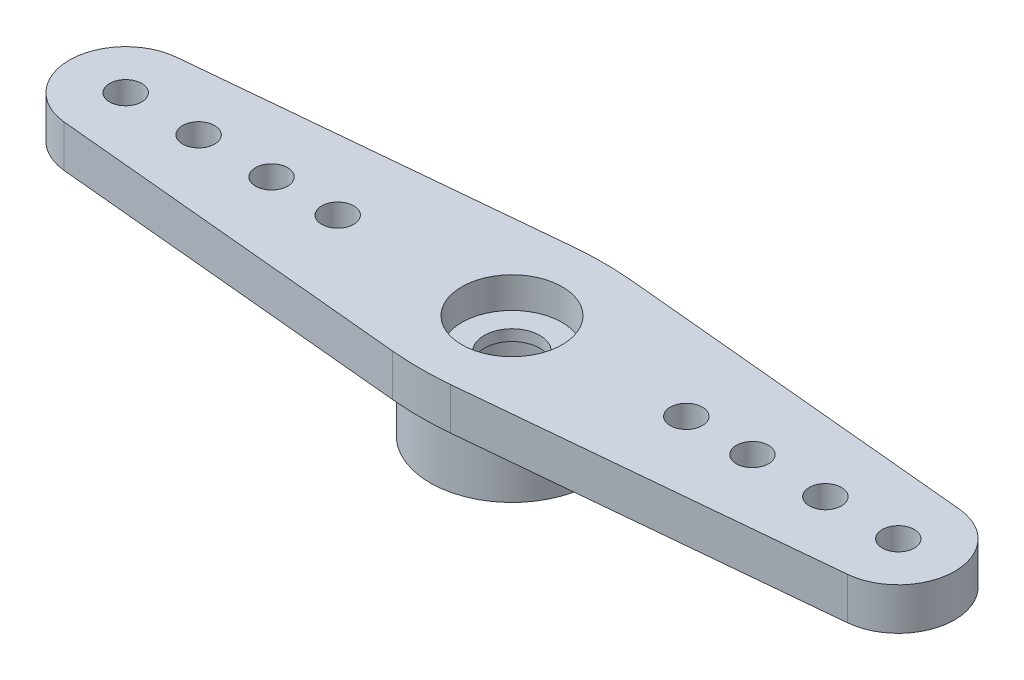
ISO-10303-21;
HEADER;
FILE_DESCRIPTION(('STEP AP214'),'2;1');
FILE_NAME('part.step','',(''),(''),'','','');
FILE_SCHEMA(('AUTOMOTIVE_DESIGN { 1 0 10303 214 1 1 1 1 }'));
ENDSEC;
DATA;
#1=APPLICATION_CONTEXT('core data for automotive mechanical design processes');
#2=APPLICATION_PROTOCOL_DEFINITION('international standard','automotive_design',2000,#1);
#3=PRODUCT_CONTEXT('',#1,'mechanical');
#4=PRODUCT('Part','Part','',(#3));
#5=PRODUCT_RELATED_PRODUCT_CATEGORY('part','',(#4));
#6=PRODUCT_DEFINITION_FORMATION('','',#4);
#7=PRODUCT_DEFINITION_CONTEXT('part definition',#1,'design');
#8=PRODUCT_DEFINITION('design','',#6,#7);
#9=PRODUCT_DEFINITION_SHAPE('','',#8);
#10=(LENGTH_UNIT() NAMED_UNIT(*) SI_UNIT(.MILLI.,.METRE.));
#11=(NAMED_UNIT(*) PLANE_ANGLE_UNIT() SI_UNIT($,.RADIAN.));
#12=(NAMED_UNIT(*) SI_UNIT($,.STERADIAN.) SOLID_ANGLE_UNIT());
#13=UNCERTAINTY_MEASURE_WITH_UNIT(LENGTH_MEASURE(1.E-05),#10,'distance_accuracy_value','');
#14=(GEOMETRIC_REPRESENTATION_CONTEXT(3) GLOBAL_UNCERTAINTY_ASSIGNED_CONTEXT((#13)) GLOBAL_UNIT_ASSIGNED_CONTEXT((#10,
#11,#12)) REPRESENTATION_CONTEXT('',''));
#15=CARTESIAN_POINT('',(0.,0.,0.));
#16=DIRECTION('',(0.,0.,1.));
#17=DIRECTION('',(1.,0.,0.));
#18=AXIS2_PLACEMENT_3D('',#15,#16,#17);
#19=CARTESIAN_POINT('',(0.,4.82616851665375,0.));
#20=DIRECTION('',(0.,-1.,0.));
#21=DIRECTION('',(0.,0.,-1.));
#22=AXIS2_PLACEMENT_3D('',#19,#20,#21);
#23=CYLINDRICAL_SURFACE('',#22,1.69612530915087);
#24=CARTESIAN_POINT('',(0.,2.26313471615911,0.));
#25=DIRECTION('',(0.,1.,0.));
#26=DIRECTION('',(0.,0.,1.));
#27=AXIS2_PLACEMENT_3D('',#24,#25,#26);
#28=CIRCLE('',#27,1.69612530915087);
#29=CARTESIAN_POINT('',(0.,2.26313471615911,1.69612530915087));
#30=VERTEX_POINT('',#29);
#31=EDGE_CURVE('E200',#30,#30,#28,.T.);
#32=ORIENTED_EDGE('',*,*,#31,.F.);
#33=EDGE_LOOP('',(#32));
#34=FACE_BOUND('',#33,.T.);
#35=CARTESIAN_POINT('',(0.,2.94158483981945,0.));
#36=DIRECTION('',(0.,1.,0.));
#37=DIRECTION('',(0.,0.,1.));
#38=AXIS2_PLACEMENT_3D('',#35,#36,#37);
#39=CIRCLE('',#38,1.69612530915087);
#40=CARTESIAN_POINT('',(0.,2.94158483981945,1.69612530915087));
#41=VERTEX_POINT('',#40);
#42=EDGE_CURVE('E360',#41,#41,#39,.F.);
#43=ORIENTED_EDGE('',*,*,#42,.F.);
#44=EDGE_LOOP('',(#43));
#45=FACE_BOUND('',#44,.T.);
#46=ADVANCED_FACE('F38',(#34,#45),#23,.F.);
#47=CARTESIAN_POINT('',(0.,-1.50603263750948,0.));
#48=DIRECTION('',(0.,1.,0.));
#49=DIRECTION('',(0.,0.,1.));
#50=AXIS2_PLACEMENT_3D('',#47,#48,#49);
#51=PLANE('',#50);
#52=CARTESIAN_POINT('',(0.,-1.50603263750948,0.));
#53=DIRECTION('',(0.,1.,0.));
#54=DIRECTION('',(0.,0.,1.));
#55=AXIS2_PLACEMENT_3D('',#52,#53,#54);
#56=CIRCLE('',#55,4.99414674361088);
#57=CARTESIAN_POINT('',(0.,-1.50603263750948,4.99414674361088));
#58=VERTEX_POINT('',#57);
#59=EDGE_CURVE('E214',#58,#58,#56,.T.);
#60=ORIENTED_EDGE('',*,*,#59,.F.);
#61=EDGE_LOOP('',(#60));
#62=FACE_BOUND('',#61,.T.);
#63=CARTESIAN_POINT('',(0.,-1.50603263750948,0.));
#64=DIRECTION('',(0.,1.,0.));
#65=DIRECTION('',(0.,0.,1.));
#66=AXIS2_PLACEMENT_3D('',#63,#64,#65);
#67=CIRCLE('',#66,3.31686727122836);
#68=CARTESIAN_POINT('',(0.,-1.50603263750948,3.31686727122836));
#69=VERTEX_POINT('',#68);
#70=EDGE_CURVE('E211',#69,#69,#67,.T.);
#71=ORIENTED_EDGE('',*,*,#70,.T.);
#72=EDGE_LOOP('',(#71));
#73=FACE_BOUND('',#72,.T.);
#74=ADVANCED_FACE('F261',(#62,#73),#51,.F.);
#75=CARTESIAN_POINT('',(0.,2.26313471615911,0.));
#76=DIRECTION('',(0.,-1.,0.));
#77=DIRECTION('',(0.,0.,-1.));
#78=AXIS2_PLACEMENT_3D('',#75,#76,#77);
#79=CYLINDRICAL_SURFACE('',#78,4.99414674361088);
#80=CARTESIAN_POINT('',(0.,2.26313471615911,0.));
#81=DIRECTION('',(0.,1.,0.));
#82=DIRECTION('',(0.,0.,1.));
#83=AXIS2_PLACEMENT_3D('',#80,#81,#82);
#84=CIRCLE('',#83,4.99414674361088);
#85=CARTESIAN_POINT('',(0.,2.26313471615911,4.99414674361088));
#86=VERTEX_POINT('',#85);
#87=EDGE_CURVE('E215',#86,#86,#84,.T.);
#88=ORIENTED_EDGE('',*,*,#87,.F.);
#89=EDGE_LOOP('',(#88));
#90=FACE_BOUND('',#89,.T.);
#91=ORIENTED_EDGE('',*,*,#59,.T.);
#92=EDGE_LOOP('',(#91));
#93=FACE_BOUND('',#92,.T.);
#94=ADVANCED_FACE('F267',(#90,#93),#79,.T.);
#95=CARTESIAN_POINT('',(0.,2.26313471615911,0.));
#96=DIRECTION('',(0.,-1.,0.));
#97=DIRECTION('',(0.,0.,-1.));
#98=AXIS2_PLACEMENT_3D('',#95,#96,#97);
#99=CYLINDRICAL_SURFACE('',#98,3.31686727122836);
#100=CARTESIAN_POINT('',(0.,2.26313471615911,0.));
#101=DIRECTION('',(0.,1.,0.));
#102=DIRECTION('',(0.,0.,1.));
#103=AXIS2_PLACEMENT_3D('',#100,#101,#102);
#104=CIRCLE('',#103,3.31686727122836);
#105=CARTESIAN_POINT('',(0.,2.26313471615911,3.31686727122836));
#106=VERTEX_POINT('',#105);
#107=EDGE_CURVE('E123',#106,#106,#104,.T.);
#108=ORIENTED_EDGE('',*,*,#107,.T.);
#109=EDGE_LOOP('',(#108));
#110=FACE_BOUND('',#109,.T.);
#111=ORIENTED_EDGE('',*,*,#70,.F.);
#112=EDGE_LOOP('',(#111));
#113=FACE_BOUND('',#112,.T.);
#114=ADVANCED_FACE('F320',(#110,#113),#99,.F.);
#115=CARTESIAN_POINT('',(-43.123904383595,2.26313471615911,0.));
#116=DIRECTION('',(0.,1.,0.));
#117=DIRECTION('',(0.,0.,1.));
#118=AXIS2_PLACEMENT_3D('',#115,#116,#117);
#119=PLANE('',#118);
#120=CARTESIAN_POINT('',(-14.6620610057708,2.26313471615911,0.));
#121=DIRECTION('',(0.,1.,0.));
#122=DIRECTION('',(0.,0.,1.));
#123=AXIS2_PLACEMENT_3D('',#120,#121,#122);
#124=CIRCLE('',#123,0.979983511953833);
#125=CARTESIAN_POINT('',(-14.6620610057708,2.26313471615911,0.979983511953833));
#126=VERTEX_POINT('',#125);
#127=EDGE_CURVE('E163',#126,#126,#124,.F.);
#128=ORIENTED_EDGE('',*,*,#127,.F.);
#129=EDGE_LOOP('',(#128));
#130=FACE_BOUND('',#129,.T.);
#131=DIRECTION('',(-0.995596740434201,0.,0.0937396950965555));
#132=VECTOR('',#131,1.);
#133=CARTESIAN_POINT('',(-43.2743750893069,2.26313471615911,-1.59812920218379));
#134=LINE('',#133,#132);
#135=CARTESIAN_POINT('',(-1.76660299250389,2.26313471615911,-5.5062636329923));
#136=VERTEX_POINT('',#135);
#137=CARTESIAN_POINT('',(-23.8797010065607,2.26313471615911,-3.4242207924604));
#138=VERTEX_POINT('',#137);
#139=EDGE_CURVE('E119',#136,#138,#134,.T.);
#140=ORIENTED_EDGE('',*,*,#139,.F.);
#141=CARTESIAN_POINT('',(0.,2.26313471615911,13.2565900243249));
#142=DIRECTION('',(0.,1.,0.));
#143=DIRECTION('',(0.,0.,1.));
#144=AXIS2_PLACEMENT_3D('',#141,#142,#143);
#145=CIRCLE('',#144,18.8458367683429);
#146=CARTESIAN_POINT('',(1.76660299250396,2.26313471615911,-5.5062636329923));
#147=VERTEX_POINT('',#146);
#148=EDGE_CURVE('E224',#136,#147,#145,.F.);
#149=ORIENTED_EDGE('',*,*,#148,.T.);
#150=DIRECTION('',(0.995596740434201,0.,0.0937396950965555));
#151=VECTOR('',#150,1.);
#152=CARTESIAN_POINT('',(-42.215562932358,2.26313471615911,-9.64737283518253));
#153=LINE('',#152,#151);
#154=CARTESIAN_POINT('',(23.8797010065607,2.26313471615911,-3.4242207924604));
#155=VERTEX_POINT('',#154);
#156=EDGE_CURVE('E177',#147,#155,#153,.T.);
#157=ORIENTED_EDGE('',*,*,#156,.T.);
#158=CARTESIAN_POINT('',(23.5572959604287,2.26313471615911,0.));
#159=DIRECTION('',(0.,1.,0.));
#160=DIRECTION('',(0.,0.,1.));
#161=AXIS2_PLACEMENT_3D('',#158,#159,#160);
#162=CIRCLE('',#161,3.43936521022259);
#163=CARTESIAN_POINT('',(23.8797010065607,2.26313471615911,3.4242207924604));
#164=VERTEX_POINT('',#163);
#165=EDGE_CURVE('E174',#164,#155,#162,.T.);
#166=ORIENTED_EDGE('',*,*,#165,.F.);
#167=DIRECTION('',(0.995596740434201,0.,-0.0937396950965555));
#168=VECTOR('',#167,1.);
#169=CARTESIAN_POINT('',(-42.215562932358,2.26313471615911,9.64737283518253));
#170=LINE('',#169,#168);
#171=CARTESIAN_POINT('',(1.76660299250394,2.26313471615911,5.5062636329923));
#172=VERTEX_POINT('',#171);
#173=EDGE_CURVE('E172',#172,#164,#170,.T.);
#174=ORIENTED_EDGE('',*,*,#173,.F.);
#175=CARTESIAN_POINT('',(0.,2.26313471615911,-13.256590024325));
#176=DIRECTION('',(0.,1.,0.));
#177=DIRECTION('',(0.,0.,1.));
#178=AXIS2_PLACEMENT_3D('',#175,#176,#177);
#179=CIRCLE('',#178,18.8458367683429);
#180=CARTESIAN_POINT('',(-1.7666029925039,2.26313471615911,5.5062636329923));
#181=VERTEX_POINT('',#180);
#182=EDGE_CURVE('E222',#172,#181,#179,.F.);
#183=ORIENTED_EDGE('',*,*,#182,.T.);
#184=DIRECTION('',(-0.995596740434201,0.,-0.0937396950965555));
#185=VECTOR('',#184,1.);
#186=CARTESIAN_POINT('',(-43.2743750893069,2.26313471615911,1.59812920218379));
#187=LINE('',#186,#185);
#188=CARTESIAN_POINT('',(-23.8797010065607,2.26313471615911,3.4242207924604));
#189=VERTEX_POINT('',#188);
#190=EDGE_CURVE('E170',#181,#189,#187,.T.);
#191=ORIENTED_EDGE('',*,*,#190,.T.);
#192=CARTESIAN_POINT('',(-23.5572959604287,2.26313471615911,0.));
#193=DIRECTION('',(0.,1.,0.));
#194=DIRECTION('',(0.,0.,1.));
#195=AXIS2_PLACEMENT_3D('',#192,#193,#194);
#196=CIRCLE('',#195,3.43936521022259);
#197=EDGE_CURVE('E168',#189,#138,#196,.F.);
#198=ORIENTED_EDGE('',*,*,#197,.T.);
#199=EDGE_LOOP('',(#140,#149,#157,#166,#174,#183,#191,#198));
#200=FACE_BOUND('',#199,.T.);
#201=CARTESIAN_POINT('',(-10.6290519373454,2.26313471615911,0.));
#202=DIRECTION('',(0.,1.,0.));
#203=DIRECTION('',(0.,0.,1.));
#204=AXIS2_PLACEMENT_3D('',#201,#202,#203);
#205=CIRCLE('',#204,0.979983511953833);
#206=CARTESIAN_POINT('',(-10.6290519373454,2.26313471615911,0.979983511953833));
#207=VERTEX_POINT('',#206);
#208=EDGE_CURVE('E179',#207,#207,#205,.F.);
#209=ORIENTED_EDGE('',*,*,#208,.F.);
#210=EDGE_LOOP('',(#209));
#211=FACE_BOUND('',#210,.T.);
#212=CARTESIAN_POINT('',(-19.1096784830998,2.26313471615911,0.));
#213=DIRECTION('',(0.,1.,0.));
#214=DIRECTION('',(0.,0.,1.));
#215=AXIS2_PLACEMENT_3D('',#212,#213,#214);
#216=CIRCLE('',#215,0.979983511953831);
#217=CARTESIAN_POINT('',(-19.1096784830998,2.26313471615911,0.979983511953831));
#218=VERTEX_POINT('',#217);
#219=EDGE_CURVE('E182',#218,#218,#216,.F.);
#220=ORIENTED_EDGE('',*,*,#219,.F.);
#221=EDGE_LOOP('',(#220));
#222=FACE_BOUND('',#221,.T.);
#223=CARTESIAN_POINT('',(-23.5572959604287,2.26313471615911,0.));
#224=DIRECTION('',(0.,1.,0.));
#225=DIRECTION('',(0.,0.,1.));
#226=AXIS2_PLACEMENT_3D('',#223,#224,#225);
#227=CIRCLE('',#226,0.979983511953831);
#228=CARTESIAN_POINT('',(-23.5572959604287,2.26313471615911,0.979983511953831));
#229=VERTEX_POINT('',#228);
#230=EDGE_CURVE('E185',#229,#229,#227,.F.);
#231=ORIENTED_EDGE('',*,*,#230,.F.);
#232=EDGE_LOOP('',(#231));
#233=FACE_BOUND('',#232,.T.);
#234=CARTESIAN_POINT('',(19.1096784830998,2.26313471615911,0.));
#235=DIRECTION('',(0.,1.,0.));
#236=DIRECTION('',(0.,0.,1.));
#237=AXIS2_PLACEMENT_3D('',#234,#235,#236);
#238=CIRCLE('',#237,0.979983511953831);
#239=CARTESIAN_POINT('',(19.1096784830998,2.26313471615911,0.979983511953831));
#240=VERTEX_POINT('',#239);
#241=EDGE_CURVE('E188',#240,#240,#238,.T.);
#242=ORIENTED_EDGE('',*,*,#241,.T.);
#243=EDGE_LOOP('',(#242));
#244=FACE_BOUND('',#243,.T.);
#245=CARTESIAN_POINT('',(14.6620610057708,2.26313471615911,0.));
#246=DIRECTION('',(0.,1.,0.));
#247=DIRECTION('',(0.,0.,1.));
#248=AXIS2_PLACEMENT_3D('',#245,#246,#247);
#249=CIRCLE('',#248,0.979983511953833);
#250=CARTESIAN_POINT('',(14.6620610057708,2.26313471615911,0.979983511953833));
#251=VERTEX_POINT('',#250);
#252=EDGE_CURVE('E191',#251,#251,#249,.T.);
#253=ORIENTED_EDGE('',*,*,#252,.T.);
#254=EDGE_LOOP('',(#253));
#255=FACE_BOUND('',#254,.T.);
#256=CARTESIAN_POINT('',(10.6290519373454,2.26313471615911,0.));
#257=DIRECTION('',(0.,1.,0.));
#258=DIRECTION('',(0.,0.,1.));
#259=AXIS2_PLACEMENT_3D('',#256,#257,#258);
#260=CIRCLE('',#259,0.979983511953833);
#261=CARTESIAN_POINT('',(10.6290519373454,2.26313471615911,0.979983511953833));
#262=VERTEX_POINT('',#261);
#263=EDGE_CURVE('E194',#262,#262,#260,.T.);
#264=ORIENTED_EDGE('',*,*,#263,.T.);
#265=EDGE_LOOP('',(#264));
#266=FACE_BOUND('',#265,.T.);
#267=CARTESIAN_POINT('',(23.5572959604287,2.26313471615911,0.));
#268=DIRECTION('',(0.,1.,0.));
#269=DIRECTION('',(0.,0.,1.));
#270=AXIS2_PLACEMENT_3D('',#267,#268,#269);
#271=CIRCLE('',#270,0.979983511953831);
#272=CARTESIAN_POINT('',(23.5572959604287,2.26313471615911,0.979983511953831));
#273=VERTEX_POINT('',#272);
#274=EDGE_CURVE('E197',#273,#273,#271,.T.);
#275=ORIENTED_EDGE('',*,*,#274,.T.);
#276=EDGE_LOOP('',(#275));
#277=FACE_BOUND('',#276,.T.);
#278=ORIENTED_EDGE('',*,*,#87,.T.);
#279=EDGE_LOOP('',(#278));
#280=FACE_BOUND('',#279,.T.);
#281=ADVANCED_FACE('F238',(#130,#200,#211,#222,#233,#244,#255,#266,#277,#280),#119,.F.);
#282=CARTESIAN_POINT('',(-43.2743750893069,4.82616851665375,-1.59812920218379));
#283=DIRECTION('',(0.0937396950965555,0.,0.995596740434201));
#284=DIRECTION('',(0.995596740434201,0.,-0.0937396950965555));
#285=AXIS2_PLACEMENT_3D('',#282,#283,#284);
#286=PLANE('',#285);
#287=DIRECTION('',(-0.995596740434201,0.,0.0937396950965555));
#288=VECTOR('',#287,1.);
#289=CARTESIAN_POINT('',(-43.2743750893069,4.82616851665375,-1.59812920218379));
#290=LINE('',#289,#288);
#291=CARTESIAN_POINT('',(-1.76660299250389,4.82616851665375,-5.5062636329923));
#292=VERTEX_POINT('',#291);
#293=CARTESIAN_POINT('',(-23.8797010065607,4.82616851665375,-3.4242207924604));
#294=VERTEX_POINT('',#293);
#295=EDGE_CURVE('E101',#292,#294,#290,.T.);
#296=ORIENTED_EDGE('',*,*,#295,.F.);
#297=DIRECTION('',(0.,-1.,0.));
#298=VECTOR('',#297,1.);
#299=CARTESIAN_POINT('',(-1.7666029925039,2.26313471615911,-5.5062636329923));
#300=LINE('',#299,#298);
#301=EDGE_CURVE('E218',#292,#136,#300,.T.);
#302=ORIENTED_EDGE('',*,*,#301,.T.);
#303=ORIENTED_EDGE('',*,*,#139,.T.);
#304=DIRECTION('',(0.,-1.,0.));
#305=VECTOR('',#304,1.);
#306=CARTESIAN_POINT('',(-23.8797010065607,4.82616851665375,-3.4242207924604));
#307=LINE('',#306,#305);
#308=EDGE_CURVE('E116',#294,#138,#307,.T.);
#309=ORIENTED_EDGE('',*,*,#308,.F.);
#310=EDGE_LOOP('',(#296,#302,#303,#309));
#311=FACE_BOUND('',#310,.T.);
#312=ADVANCED_FACE('F117',(#311),#286,.F.);
#313=CARTESIAN_POINT('',(-23.5572959604287,4.82616851665375,0.));
#314=DIRECTION('',(0.,-1.,0.));
#315=DIRECTION('',(0.,0.,-1.));
#316=AXIS2_PLACEMENT_3D('',#313,#314,#315);
#317=CYLINDRICAL_SURFACE('',#316,3.43936521022259);
#318=ORIENTED_EDGE('',*,*,#197,.F.);
#319=DIRECTION('',(0.,-1.,0.));
#320=VECTOR('',#319,1.);
#321=CARTESIAN_POINT('',(-23.8797010065607,4.82616851665375,3.4242207924604));
#322=LINE('',#321,#320);
#323=CARTESIAN_POINT('',(-23.8797010065607,4.82616851665375,3.4242207924604));
#324=VERTEX_POINT('',#323);
#325=EDGE_CURVE('E124',#324,#189,#322,.T.);
#326=ORIENTED_EDGE('',*,*,#325,.F.);
#327=CARTESIAN_POINT('',(-23.5572959604287,4.82616851665375,0.));
#328=DIRECTION('',(0.,1.,0.));
#329=DIRECTION('',(0.,0.,1.));
#330=AXIS2_PLACEMENT_3D('',#327,#328,#329);
#331=CIRCLE('',#330,3.43936521022259);
#332=EDGE_CURVE('E107',#324,#294,#331,.F.);
#333=ORIENTED_EDGE('',*,*,#332,.T.);
#334=ORIENTED_EDGE('',*,*,#308,.T.);
#335=EDGE_LOOP('',(#318,#326,#333,#334));
#336=FACE_BOUND('',#335,.T.);
#337=ADVANCED_FACE('F127',(#336),#317,.T.);
#338=CARTESIAN_POINT('',(-43.2743750893069,4.82616851665375,1.59812920218379));
#339=DIRECTION('',(-0.0937396950965555,0.,0.995596740434201));
#340=DIRECTION('',(0.995596740434201,0.,0.0937396950965555));
#341=AXIS2_PLACEMENT_3D('',#338,#339,#340);
#342=PLANE('',#341);
#343=ORIENTED_EDGE('',*,*,#190,.F.);
#344=DIRECTION('',(0.,-1.,0.));
#345=VECTOR('',#344,1.);
#346=CARTESIAN_POINT('',(-1.76660299250392,4.82616851665375,5.5062636329923));
#347=LINE('',#346,#345);
#348=CARTESIAN_POINT('',(-1.7666029925039,4.82616851665375,5.5062636329923));
#349=VERTEX_POINT('',#348);
#350=EDGE_CURVE('E11',#181,#349,#347,.F.);
#351=ORIENTED_EDGE('',*,*,#350,.T.);
#352=DIRECTION('',(-0.995596740434201,0.,-0.0937396950965555));
#353=VECTOR('',#352,1.);
#354=CARTESIAN_POINT('',(-43.2743750893069,4.82616851665375,1.59812920218379));
#355=LINE('',#354,#353);
#356=EDGE_CURVE('E129',#349,#324,#355,.T.);
#357=ORIENTED_EDGE('',*,*,#356,.T.);
#358=ORIENTED_EDGE('',*,*,#325,.T.);
#359=EDGE_LOOP('',(#343,#351,#357,#358));
#360=FACE_BOUND('',#359,.T.);
#361=ADVANCED_FACE('F249',(#360),#342,.T.);
#362=CARTESIAN_POINT('',(-42.215562932358,4.82616851665375,9.64737283518253));
#363=DIRECTION('',(-0.0937396950965555,0.,-0.995596740434201));
#364=DIRECTION('',(-0.995596740434201,0.,0.0937396950965555));
#365=AXIS2_PLACEMENT_3D('',#362,#363,#364);
#366=PLANE('',#365);
#367=DIRECTION('',(0.995596740434201,0.,-0.0937396950965555));
#368=VECTOR('',#367,1.);
#369=CARTESIAN_POINT('',(-42.215562932358,4.82616851665375,9.64737283518253));
#370=LINE('',#369,#368);
#371=CARTESIAN_POINT('',(1.76660299250394,4.82616851665375,5.5062636329923));
#372=VERTEX_POINT('',#371);
#373=CARTESIAN_POINT('',(23.8797010065607,4.82616851665375,3.4242207924604));
#374=VERTEX_POINT('',#373);
#375=EDGE_CURVE('E131',#372,#374,#370,.T.);
#376=ORIENTED_EDGE('',*,*,#375,.F.);
#377=DIRECTION('',(0.,-1.,0.));
#378=VECTOR('',#377,1.);
#379=CARTESIAN_POINT('',(1.76660299250393,2.26313471615911,5.5062636329923));
#380=LINE('',#379,#378);
#381=EDGE_CURVE('E46',#372,#172,#380,.T.);
#382=ORIENTED_EDGE('',*,*,#381,.T.);
#383=ORIENTED_EDGE('',*,*,#173,.T.);
#384=DIRECTION('',(0.,-1.,0.));
#385=VECTOR('',#384,1.);
#386=CARTESIAN_POINT('',(23.8797010065607,4.82616851665375,3.4242207924604));
#387=LINE('',#386,#385);
#388=EDGE_CURVE('E205',#374,#164,#387,.T.);
#389=ORIENTED_EDGE('',*,*,#388,.F.);
#390=EDGE_LOOP('',(#376,#382,#383,#389));
#391=FACE_BOUND('',#390,.T.);
#392=ADVANCED_FACE('F233',(#391),#366,.F.);
#393=CARTESIAN_POINT('',(23.5572959604287,4.82616851665375,0.));
#394=DIRECTION('',(0.,-1.,0.));
#395=DIRECTION('',(0.,0.,-1.));
#396=AXIS2_PLACEMENT_3D('',#393,#394,#395);
#397=CYLINDRICAL_SURFACE('',#396,3.43936521022259);
#398=ORIENTED_EDGE('',*,*,#165,.T.);
#399=DIRECTION('',(0.,-1.,0.));
#400=VECTOR('',#399,1.);
#401=CARTESIAN_POINT('',(23.8797010065607,4.82616851665375,-3.4242207924604));
#402=LINE('',#401,#400);
#403=CARTESIAN_POINT('',(23.8797010065607,4.82616851665375,-3.4242207924604));
#404=VERTEX_POINT('',#403);
#405=EDGE_CURVE('E162',#404,#155,#402,.T.);
#406=ORIENTED_EDGE('',*,*,#405,.F.);
#407=CARTESIAN_POINT('',(23.5572959604287,4.82616851665375,0.));
#408=DIRECTION('',(0.,1.,0.));
#409=DIRECTION('',(0.,0.,1.));
#410=AXIS2_PLACEMENT_3D('',#407,#408,#409);
#411=CIRCLE('',#410,3.43936521022259);
#412=EDGE_CURVE('E136',#374,#404,#411,.T.);
#413=ORIENTED_EDGE('',*,*,#412,.F.);
#414=ORIENTED_EDGE('',*,*,#388,.T.);
#415=EDGE_LOOP('',(#398,#406,#413,#414));
#416=FACE_BOUND('',#415,.T.);
#417=ADVANCED_FACE('F243',(#416),#397,.T.);
#418=CARTESIAN_POINT('',(23.5572959604287,4.82616851665375,0.));
#419=DIRECTION('',(0.,-1.,0.));
#420=DIRECTION('',(0.,0.,-1.));
#421=AXIS2_PLACEMENT_3D('',#418,#419,#420);
#422=CYLINDRICAL_SURFACE('',#421,0.979983511953831);
#423=CARTESIAN_POINT('',(23.5572959604287,4.82616851665375,0.));
#424=DIRECTION('',(0.,1.,0.));
#425=DIRECTION('',(0.,0.,1.));
#426=AXIS2_PLACEMENT_3D('',#423,#424,#425);
#427=CIRCLE('',#426,0.979983511953831);
#428=CARTESIAN_POINT('',(23.5572959604287,4.82616851665375,0.979983511953831));
#429=VERTEX_POINT('',#428);
#430=EDGE_CURVE('E159',#429,#429,#427,.T.);
#431=ORIENTED_EDGE('',*,*,#430,.T.);
#432=EDGE_LOOP('',(#431));
#433=FACE_BOUND('',#432,.T.);
#434=ORIENTED_EDGE('',*,*,#274,.F.);
#435=EDGE_LOOP('',(#434));
#436=FACE_BOUND('',#435,.T.);
#437=ADVANCED_FACE('F275',(#433,#436),#422,.F.);
#438=CARTESIAN_POINT('',(10.6290519373454,4.82616851665375,0.));
#439=DIRECTION('',(0.,-1.,0.));
#440=DIRECTION('',(0.,0.,-1.));
#441=AXIS2_PLACEMENT_3D('',#438,#439,#440);
#442=CYLINDRICAL_SURFACE('',#441,0.979983511953833);
#443=CARTESIAN_POINT('',(10.6290519373454,4.82616851665375,0.));
#444=DIRECTION('',(0.,1.,0.));
#445=DIRECTION('',(0.,0.,1.));
#446=AXIS2_PLACEMENT_3D('',#443,#444,#445);
#447=CIRCLE('',#446,0.979983511953833);
#448=CARTESIAN_POINT('',(10.6290519373454,4.82616851665375,0.979983511953833));
#449=VERTEX_POINT('',#448);
#450=EDGE_CURVE('E156',#449,#449,#447,.T.);
#451=ORIENTED_EDGE('',*,*,#450,.T.);
#452=EDGE_LOOP('',(#451));
#453=FACE_BOUND('',#452,.T.);
#454=ORIENTED_EDGE('',*,*,#263,.F.);
#455=EDGE_LOOP('',(#454));
#456=FACE_BOUND('',#455,.T.);
#457=ADVANCED_FACE('F278',(#453,#456),#442,.F.);
#458=CARTESIAN_POINT('',(14.6620610057708,4.82616851665375,0.));
#459=DIRECTION('',(0.,-1.,0.));
#460=DIRECTION('',(0.,0.,-1.));
#461=AXIS2_PLACEMENT_3D('',#458,#459,#460);
#462=CYLINDRICAL_SURFACE('',#461,0.979983511953833);
#463=CARTESIAN_POINT('',(14.6620610057708,4.82616851665375,0.));
#464=DIRECTION('',(0.,1.,0.));
#465=DIRECTION('',(0.,0.,1.));
#466=AXIS2_PLACEMENT_3D('',#463,#464,#465);
#467=CIRCLE('',#466,0.979983511953833);
#468=CARTESIAN_POINT('',(14.6620610057708,4.82616851665375,0.979983511953833));
#469=VERTEX_POINT('',#468);
#470=EDGE_CURVE('E153',#469,#469,#467,.T.);
#471=ORIENTED_EDGE('',*,*,#470,.T.);
#472=EDGE_LOOP('',(#471));
#473=FACE_BOUND('',#472,.T.);
#474=ORIENTED_EDGE('',*,*,#252,.F.);
#475=EDGE_LOOP('',(#474));
#476=FACE_BOUND('',#475,.T.);
#477=ADVANCED_FACE('F282',(#473,#476),#462,.F.);
#478=CARTESIAN_POINT('',(19.1096784830998,4.82616851665375,0.));
#479=DIRECTION('',(0.,-1.,0.));
#480=DIRECTION('',(0.,0.,-1.));
#481=AXIS2_PLACEMENT_3D('',#478,#479,#480);
#482=CYLINDRICAL_SURFACE('',#481,0.979983511953831);
#483=CARTESIAN_POINT('',(19.1096784830998,4.82616851665375,0.));
#484=DIRECTION('',(0.,1.,0.));
#485=DIRECTION('',(0.,0.,1.));
#486=AXIS2_PLACEMENT_3D('',#483,#484,#485);
#487=CIRCLE('',#486,0.979983511953831);
#488=CARTESIAN_POINT('',(19.1096784830998,4.82616851665375,0.979983511953831));
#489=VERTEX_POINT('',#488);
#490=EDGE_CURVE('E150',#489,#489,#487,.T.);
#491=ORIENTED_EDGE('',*,*,#490,.T.);
#492=EDGE_LOOP('',(#491));
#493=FACE_BOUND('',#492,.T.);
#494=ORIENTED_EDGE('',*,*,#241,.F.);
#495=EDGE_LOOP('',(#494));
#496=FACE_BOUND('',#495,.T.);
#497=ADVANCED_FACE('F286',(#493,#496),#482,.F.);
#498=CARTESIAN_POINT('',(-23.5572959604287,4.82616851665375,0.));
#499=DIRECTION('',(0.,-1.,0.));
#500=DIRECTION('',(0.,0.,-1.));
#501=AXIS2_PLACEMENT_3D('',#498,#499,#500);
#502=CYLINDRICAL_SURFACE('',#501,0.979983511953831);
#503=CARTESIAN_POINT('',(-23.5572959604287,4.82616851665375,0.));
#504=DIRECTION('',(0.,1.,0.));
#505=DIRECTION('',(0.,0.,1.));
#506=AXIS2_PLACEMENT_3D('',#503,#504,#505);
#507=CIRCLE('',#506,0.979983511953831);
#508=CARTESIAN_POINT('',(-23.5572959604287,4.82616851665375,0.979983511953831));
#509=VERTEX_POINT('',#508);
#510=EDGE_CURVE('E147',#509,#509,#507,.F.);
#511=ORIENTED_EDGE('',*,*,#510,.F.);
#512=EDGE_LOOP('',(#511));
#513=FACE_BOUND('',#512,.T.);
#514=ORIENTED_EDGE('',*,*,#230,.T.);
#515=EDGE_LOOP('',(#514));
#516=FACE_BOUND('',#515,.T.);
#517=ADVANCED_FACE('F290',(#513,#516),#502,.F.);
#518=CARTESIAN_POINT('',(-19.1096784830998,4.82616851665375,0.));
#519=DIRECTION('',(0.,-1.,0.));
#520=DIRECTION('',(0.,0.,-1.));
#521=AXIS2_PLACEMENT_3D('',#518,#519,#520);
#522=CYLINDRICAL_SURFACE('',#521,0.979983511953831);
#523=CARTESIAN_POINT('',(-19.1096784830998,4.82616851665375,0.));
#524=DIRECTION('',(0.,1.,0.));
#525=DIRECTION('',(0.,0.,1.));
#526=AXIS2_PLACEMENT_3D('',#523,#524,#525);
#527=CIRCLE('',#526,0.979983511953831);
#528=CARTESIAN_POINT('',(-19.1096784830998,4.82616851665375,0.979983511953831));
#529=VERTEX_POINT('',#528);
#530=EDGE_CURVE('E144',#529,#529,#527,.F.);
#531=ORIENTED_EDGE('',*,*,#530,.F.);
#532=EDGE_LOOP('',(#531));
#533=FACE_BOUND('',#532,.T.);
#534=ORIENTED_EDGE('',*,*,#219,.T.);
#535=EDGE_LOOP('',(#534));
#536=FACE_BOUND('',#535,.T.);
#537=ADVANCED_FACE('F294',(#533,#536),#522,.F.);
#538=CARTESIAN_POINT('',(-10.6290519373454,4.82616851665375,0.));
#539=DIRECTION('',(0.,-1.,0.));
#540=DIRECTION('',(0.,0.,-1.));
#541=AXIS2_PLACEMENT_3D('',#538,#539,#540);
#542=CYLINDRICAL_SURFACE('',#541,0.979983511953833);
#543=CARTESIAN_POINT('',(-10.6290519373454,4.82616851665375,0.));
#544=DIRECTION('',(0.,1.,0.));
#545=DIRECTION('',(0.,0.,1.));
#546=AXIS2_PLACEMENT_3D('',#543,#544,#545);
#547=CIRCLE('',#546,0.979983511953833);
#548=CARTESIAN_POINT('',(-10.6290519373454,4.82616851665375,0.979983511953833));
#549=VERTEX_POINT('',#548);
#550=EDGE_CURVE('E141',#549,#549,#547,.F.);
#551=ORIENTED_EDGE('',*,*,#550,.F.);
#552=EDGE_LOOP('',(#551));
#553=FACE_BOUND('',#552,.T.);
#554=ORIENTED_EDGE('',*,*,#208,.T.);
#555=EDGE_LOOP('',(#554));
#556=FACE_BOUND('',#555,.T.);
#557=ADVANCED_FACE('F298',(#553,#556),#542,.F.);
#558=CARTESIAN_POINT('',(-42.215562932358,4.82616851665375,-9.64737283518253));
#559=DIRECTION('',(0.0937396950965555,0.,-0.995596740434201));
#560=DIRECTION('',(-0.995596740434201,0.,-0.0937396950965555));
#561=AXIS2_PLACEMENT_3D('',#558,#559,#560);
#562=PLANE('',#561);
#563=ORIENTED_EDGE('',*,*,#156,.F.);
#564=DIRECTION('',(0.,-1.,0.));
#565=VECTOR('',#564,1.);
#566=CARTESIAN_POINT('',(1.76660299250394,4.82616851665375,-5.5062636329923));
#567=LINE('',#566,#565);
#568=CARTESIAN_POINT('',(1.76660299250396,4.82616851665375,-5.5062636329923));
#569=VERTEX_POINT('',#568);
#570=EDGE_CURVE('E226',#147,#569,#567,.F.);
#571=ORIENTED_EDGE('',*,*,#570,.T.);
#572=DIRECTION('',(0.995596740434201,0.,0.0937396950965555));
#573=VECTOR('',#572,1.);
#574=CARTESIAN_POINT('',(-42.215562932358,4.82616851665375,-9.64737283518253));
#575=LINE('',#574,#573);
#576=EDGE_CURVE('E139',#569,#404,#575,.T.);
#577=ORIENTED_EDGE('',*,*,#576,.T.);
#578=ORIENTED_EDGE('',*,*,#405,.T.);
#579=EDGE_LOOP('',(#563,#571,#577,#578));
#580=FACE_BOUND('',#579,.T.);
#581=ADVANCED_FACE('F302',(#580),#562,.T.);
#582=CARTESIAN_POINT('',(-14.6620610057708,4.82616851665375,0.));
#583=DIRECTION('',(0.,-1.,0.));
#584=DIRECTION('',(0.,0.,-1.));
#585=AXIS2_PLACEMENT_3D('',#582,#583,#584);
#586=CYLINDRICAL_SURFACE('',#585,0.979983511953833);
#587=CARTESIAN_POINT('',(-14.6620610057708,4.82616851665375,0.));
#588=DIRECTION('',(0.,1.,0.));
#589=DIRECTION('',(0.,0.,1.));
#590=AXIS2_PLACEMENT_3D('',#587,#588,#589);
#591=CIRCLE('',#590,0.979983511953833);
#592=CARTESIAN_POINT('',(-14.6620610057708,4.82616851665375,0.979983511953833));
#593=VERTEX_POINT('',#592);
#594=EDGE_CURVE('E113',#593,#593,#591,.F.);
#595=ORIENTED_EDGE('',*,*,#594,.F.);
#596=EDGE_LOOP('',(#595));
#597=FACE_BOUND('',#596,.T.);
#598=ORIENTED_EDGE('',*,*,#127,.T.);
#599=EDGE_LOOP('',(#598));
#600=FACE_BOUND('',#599,.T.);
#601=ADVANCED_FACE('F306',(#597,#600),#586,.F.);
#602=CARTESIAN_POINT('',(-43.123904383595,4.82616851665375,0.));
#603=DIRECTION('',(0.,1.,0.));
#604=DIRECTION('',(0.,0.,1.));
#605=AXIS2_PLACEMENT_3D('',#602,#603,#604);
#606=PLANE('',#605);
#607=CARTESIAN_POINT('',(0.,4.82616851665375,0.));
#608=DIRECTION('',(0.,1.,0.));
#609=DIRECTION('',(0.,0.,1.));
#610=AXIS2_PLACEMENT_3D('',#607,#608,#609);
#611=CIRCLE('',#610,3.06244847485573);
#612=CARTESIAN_POINT('',(0.,4.82616851665375,3.06244847485573));
#613=VERTEX_POINT('',#612);
#614=EDGE_CURVE('E364',#613,#613,#611,.T.);
#615=ORIENTED_EDGE('',*,*,#614,.F.);
#616=EDGE_LOOP('',(#615));
#617=FACE_BOUND('',#616,.T.);
#618=ORIENTED_EDGE('',*,*,#594,.T.);
#619=EDGE_LOOP('',(#618));
#620=FACE_BOUND('',#619,.T.);
#621=ORIENTED_EDGE('',*,*,#576,.F.);
#622=CARTESIAN_POINT('',(0.,4.82616851665375,13.2565900243249));
#623=DIRECTION('',(0.,1.,0.));
#624=DIRECTION('',(0.,0.,1.));
#625=AXIS2_PLACEMENT_3D('',#622,#623,#624);
#626=CIRCLE('',#625,18.8458367683429);
#627=EDGE_CURVE('E109',#569,#292,#626,.T.);
#628=ORIENTED_EDGE('',*,*,#627,.T.);
#629=ORIENTED_EDGE('',*,*,#295,.T.);
#630=ORIENTED_EDGE('',*,*,#332,.F.);
#631=ORIENTED_EDGE('',*,*,#356,.F.);
#632=CARTESIAN_POINT('',(0.,4.82616851665375,-13.256590024325));
#633=DIRECTION('',(0.,1.,0.));
#634=DIRECTION('',(0.,0.,1.));
#635=AXIS2_PLACEMENT_3D('',#632,#633,#634);
#636=CIRCLE('',#635,18.8458367683429);
#637=EDGE_CURVE('E53',#349,#372,#636,.T.);
#638=ORIENTED_EDGE('',*,*,#637,.T.);
#639=ORIENTED_EDGE('',*,*,#375,.T.);
#640=ORIENTED_EDGE('',*,*,#412,.T.);
#641=EDGE_LOOP('',(#621,#628,#629,#630,#631,#638,#639,#640));
#642=FACE_BOUND('',#641,.T.);
#643=ORIENTED_EDGE('',*,*,#550,.T.);
#644=EDGE_LOOP('',(#643));
#645=FACE_BOUND('',#644,.T.);
#646=ORIENTED_EDGE('',*,*,#530,.T.);
#647=EDGE_LOOP('',(#646));
#648=FACE_BOUND('',#647,.T.);
#649=ORIENTED_EDGE('',*,*,#510,.T.);
#650=EDGE_LOOP('',(#649));
#651=FACE_BOUND('',#650,.T.);
#652=ORIENTED_EDGE('',*,*,#490,.F.);
#653=EDGE_LOOP('',(#652));
#654=FACE_BOUND('',#653,.T.);
#655=ORIENTED_EDGE('',*,*,#470,.F.);
#656=EDGE_LOOP('',(#655));
#657=FACE_BOUND('',#656,.T.);
#658=ORIENTED_EDGE('',*,*,#450,.F.);
#659=EDGE_LOOP('',(#658));
#660=FACE_BOUND('',#659,.T.);
#661=ORIENTED_EDGE('',*,*,#430,.F.);
#662=EDGE_LOOP('',(#661));
#663=FACE_BOUND('',#662,.T.);
#664=ADVANCED_FACE('F104',(#617,#620,#642,#645,#648,#651,#654,#657,#660,#663),#606,.T.);
#665=ORIENTED_EDGE('',*,*,#107,.F.);
#666=EDGE_LOOP('',(#665));
#667=FACE_BOUND('',#666,.T.);
#668=ORIENTED_EDGE('',*,*,#31,.T.);
#669=EDGE_LOOP('',(#668));
#670=FACE_BOUND('',#669,.T.);
#671=ADVANCED_FACE('F259',(#667,#670),#119,.F.);
#672=CARTESIAN_POINT('',(0.,4.82616851665375,13.2565900243249));
#673=DIRECTION('',(0.,1.,0.));
#674=DIRECTION('',(0.,0.,1.));
#675=AXIS2_PLACEMENT_3D('',#672,#673,#674);
#676=CYLINDRICAL_SURFACE('',#675,18.8458367683429);
#677=ORIENTED_EDGE('',*,*,#627,.F.);
#678=ORIENTED_EDGE('',*,*,#570,.F.);
#679=ORIENTED_EDGE('',*,*,#148,.F.);
#680=ORIENTED_EDGE('',*,*,#301,.F.);
#681=EDGE_LOOP('',(#677,#678,#679,#680));
#682=FACE_BOUND('',#681,.T.);
#683=ADVANCED_FACE('F248',(#682),#676,.T.);
#684=CARTESIAN_POINT('',(0.,4.82616851665375,-13.256590024325));
#685=DIRECTION('',(0.,1.,0.));
#686=DIRECTION('',(0.,0.,1.));
#687=AXIS2_PLACEMENT_3D('',#684,#685,#686);
#688=CYLINDRICAL_SURFACE('',#687,18.8458367683429);
#689=ORIENTED_EDGE('',*,*,#637,.F.);
#690=ORIENTED_EDGE('',*,*,#350,.F.);
#691=ORIENTED_EDGE('',*,*,#182,.F.);
#692=ORIENTED_EDGE('',*,*,#381,.F.);
#693=EDGE_LOOP('',(#689,#690,#691,#692));
#694=FACE_BOUND('',#693,.T.);
#695=ADVANCED_FACE('F40',(#694),#688,.T.);
#696=CARTESIAN_POINT('',(0.,2.94158483981945,0.));
#697=DIRECTION('',(0.,1.,0.));
#698=DIRECTION('',(0.,0.,1.));
#699=AXIS2_PLACEMENT_3D('',#696,#697,#698);
#700=CYLINDRICAL_SURFACE('',#699,3.06244847485573);
#701=CARTESIAN_POINT('',(0.,2.94158483981945,0.));
#702=DIRECTION('',(0.,1.,0.));
#703=DIRECTION('',(0.,0.,1.));
#704=AXIS2_PLACEMENT_3D('',#701,#702,#703);
#705=CIRCLE('',#704,3.06244847485573);
#706=CARTESIAN_POINT('',(0.,2.94158483981945,3.06244847485573));
#707=VERTEX_POINT('',#706);
#708=EDGE_CURVE('E166',#707,#707,#705,.T.);
#709=ORIENTED_EDGE('',*,*,#708,.F.);
#710=EDGE_LOOP('',(#709));
#711=FACE_BOUND('',#710,.T.);
#712=ORIENTED_EDGE('',*,*,#614,.T.);
#713=EDGE_LOOP('',(#712));
#714=FACE_BOUND('',#713,.T.);
#715=ADVANCED_FACE('F251',(#711,#714),#700,.F.);
#716=CARTESIAN_POINT('',(-42.7879689046372,2.94158483981945,1.0825129757788));
#717=DIRECTION('',(0.,1.,0.));
#718=DIRECTION('',(0.,0.,1.));
#719=AXIS2_PLACEMENT_3D('',#716,#717,#718);
#720=PLANE('',#719);
#721=ORIENTED_EDGE('',*,*,#42,.T.);
#722=EDGE_LOOP('',(#721));
#723=FACE_BOUND('',#722,.T.);
#724=ORIENTED_EDGE('',*,*,#708,.T.);
#725=EDGE_LOOP('',(#724));
#726=FACE_BOUND('',#725,.T.);
#727=ADVANCED_FACE('F256',(#723,#726),#720,.T.);
#728=CLOSED_SHELL('',(#46,#74,#94,#114,#281,#312,#337,#361,#392,#417,#437,#457,#477,#497,#517,
#537,#557,#581,#601,#664,#671,#683,#695,#715,#727));
#729=MANIFOLD_SOLID_BREP('B2',#728);
#730=ADVANCED_BREP_SHAPE_REPRESENTATION('',(#18,#729),#14);
#731=SHAPE_DEFINITION_REPRESENTATION(#9,#730);
ENDSEC;
END-ISO-10303-21;
